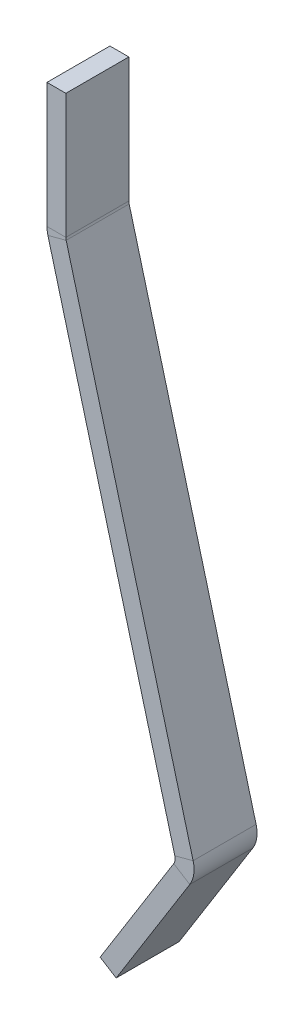
ISO-10303-21;
HEADER;
FILE_DESCRIPTION(('STEP AP214'),'2;1');
FILE_NAME('part.step','',(''),(''),'','','');
FILE_SCHEMA(('AUTOMOTIVE_DESIGN { 1 0 10303 214 1 1 1 1 }'));
ENDSEC;
DATA;
#1=APPLICATION_CONTEXT('core data for automotive mechanical design processes');
#2=APPLICATION_PROTOCOL_DEFINITION('international standard','automotive_design',2000,#1);
#3=PRODUCT_CONTEXT('',#1,'mechanical');
#4=PRODUCT('Part','Part','',(#3));
#5=PRODUCT_RELATED_PRODUCT_CATEGORY('part','',(#4));
#6=PRODUCT_DEFINITION_FORMATION('','',#4);
#7=PRODUCT_DEFINITION_CONTEXT('part definition',#1,'design');
#8=PRODUCT_DEFINITION('design','',#6,#7);
#9=PRODUCT_DEFINITION_SHAPE('','',#8);
#10=(LENGTH_UNIT() NAMED_UNIT(*) SI_UNIT(.MILLI.,.METRE.));
#11=(NAMED_UNIT(*) PLANE_ANGLE_UNIT() SI_UNIT($,.RADIAN.));
#12=(NAMED_UNIT(*) SI_UNIT($,.STERADIAN.) SOLID_ANGLE_UNIT());
#13=UNCERTAINTY_MEASURE_WITH_UNIT(LENGTH_MEASURE(1.E-05),#10,'distance_accuracy_value','');
#14=(GEOMETRIC_REPRESENTATION_CONTEXT(3) GLOBAL_UNCERTAINTY_ASSIGNED_CONTEXT((#13)) GLOBAL_UNIT_ASSIGNED_CONTEXT((#10,
#11,#12)) REPRESENTATION_CONTEXT('',''));
#15=CARTESIAN_POINT('',(0.,0.,0.));
#16=DIRECTION('',(0.,0.,1.));
#17=DIRECTION('',(1.,0.,0.));
#18=AXIS2_PLACEMENT_3D('',#15,#16,#17);
#19=CARTESIAN_POINT('',(0.0250990363554734,29.5103405549286,2.5));
#20=DIRECTION('',(0.,0.,1.));
#21=DIRECTION('',(1.,0.,0.));
#22=AXIS2_PLACEMENT_3D('',#19,#20,#21);
#23=PLANE('',#22);
#24=DIRECTION('',(-0.965925826289068,-0.258819045102522,0.));
#25=VECTOR('',#24,1.);
#26=CARTESIAN_POINT('',(0.0250990363554734,29.5103405549286,2.5));
#27=LINE('',#26,#25);
#28=CARTESIAN_POINT('',(0.0250990363554734,29.5103405549286,2.5));
#29=VERTEX_POINT('',#28);
#30=CARTESIAN_POINT('',(-1.42378970307813,29.1221119872748,2.5));
#31=VERTEX_POINT('',#30);
#32=EDGE_CURVE('E11',#29,#31,#27,.T.);
#33=ORIENTED_EDGE('',*,*,#32,.F.);
#34=CARTESIAN_POINT('',(0.736600000000001,29.7009866635511,2.5));
#35=DIRECTION('',(0.,0.,-1.));
#36=DIRECTION('',(-1.,0.,0.));
#37=AXIS2_PLACEMENT_3D('',#34,#35,#36);
#38=CIRCLE('',#37,0.7366);
#39=CARTESIAN_POINT('',(0.,29.7009866635511,2.5));
#40=VERTEX_POINT('',#39);
#41=EDGE_CURVE('E193',#40,#29,#38,.F.);
#42=ORIENTED_EDGE('',*,*,#41,.F.);
#43=DIRECTION('',(1.,0.,0.));
#44=VECTOR('',#43,1.);
#45=CARTESIAN_POINT('',(-1.5,29.7009866635511,2.5));
#46=LINE('',#45,#44);
#47=CARTESIAN_POINT('',(-1.5,29.7009866635511,2.5));
#48=VERTEX_POINT('',#47);
#49=EDGE_CURVE('E46',#48,#40,#46,.T.);
#50=ORIENTED_EDGE('',*,*,#49,.F.);
#51=CARTESIAN_POINT('',(0.736600000000001,29.7009866635511,2.5));
#52=DIRECTION('',(0.,0.,1.));
#53=DIRECTION('',(1.,0.,0.));
#54=AXIS2_PLACEMENT_3D('',#51,#52,#53);
#55=CIRCLE('',#54,2.2366);
#56=EDGE_CURVE('E205',#48,#31,#55,.T.);
#57=ORIENTED_EDGE('',*,*,#56,.T.);
#58=EDGE_LOOP('',(#33,#42,#50,#57));
#59=FACE_BOUND('',#58,.T.);
#60=ADVANCED_FACE('F39',(#59),#23,.T.);
#61=CARTESIAN_POINT('',(-1.5,29.7009866635511,2.5));
#62=DIRECTION('',(0.,0.,1.));
#63=DIRECTION('',(1.,0.,0.));
#64=AXIS2_PLACEMENT_3D('',#61,#62,#63);
#65=PLANE('',#64);
#66=DIRECTION('',(0.258819045102522,-0.965925826289068,0.));
#67=VECTOR('',#66,1.);
#68=CARTESIAN_POINT('',(0.,29.6040114338282,2.5));
#69=LINE('',#68,#67);
#70=CARTESIAN_POINT('',(10.1010599313044,-8.09365744009794,2.5));
#71=VERTEX_POINT('',#70);
#72=EDGE_CURVE('E190',#29,#71,#69,.T.);
#73=ORIENTED_EDGE('',*,*,#72,.F.);
#74=ORIENTED_EDGE('',*,*,#32,.T.);
#75=DIRECTION('',(0.258819045102522,-0.965925826289068,0.));
#76=VECTOR('',#75,1.);
#77=CARTESIAN_POINT('',(-1.4488887394336,29.2157828661745,2.5));
#78=LINE('',#77,#76);
#79=CARTESIAN_POINT('',(8.65217119187082,-8.48188600775172,2.5));
#80=VERTEX_POINT('',#79);
#81=EDGE_CURVE('E208',#31,#80,#78,.T.);
#82=ORIENTED_EDGE('',*,*,#81,.T.);
#83=DIRECTION('',(0.965925826289068,0.258819045102522,0.));
#84=VECTOR('',#83,1.);
#85=CARTESIAN_POINT('',(8.65217119187082,-8.48188600775172,2.5));
#86=LINE('',#85,#84);
#87=EDGE_CURVE('E60',#80,#71,#86,.T.);
#88=ORIENTED_EDGE('',*,*,#87,.T.);
#89=EDGE_LOOP('',(#73,#74,#82,#88));
#90=FACE_BOUND('',#89,.T.);
#91=ADVANCED_FACE('F284',(#90),#65,.T.);
#92=CARTESIAN_POINT('',(0.,29.7009866635511,-2.5));
#93=DIRECTION('',(0.,0.,-1.));
#94=DIRECTION('',(-1.,0.,0.));
#95=AXIS2_PLACEMENT_3D('',#92,#93,#94);
#96=PLANE('',#95);
#97=DIRECTION('',(-1.,0.,0.));
#98=VECTOR('',#97,1.);
#99=CARTESIAN_POINT('',(0.,29.7009866635511,-2.5));
#100=LINE('',#99,#98);
#101=CARTESIAN_POINT('',(0.,29.7009866635511,-2.5));
#102=VERTEX_POINT('',#101);
#103=CARTESIAN_POINT('',(-1.5,29.7009866635511,-2.5));
#104=VERTEX_POINT('',#103);
#105=EDGE_CURVE('E246',#102,#104,#100,.T.);
#106=ORIENTED_EDGE('',*,*,#105,.F.);
#107=CARTESIAN_POINT('',(0.736600000000001,29.7009866635511,-2.5));
#108=DIRECTION('',(0.,0.,-1.));
#109=DIRECTION('',(-1.,0.,0.));
#110=AXIS2_PLACEMENT_3D('',#107,#108,#109);
#111=CIRCLE('',#110,0.7366);
#112=CARTESIAN_POINT('',(0.0250990363554734,29.5103405549286,-2.5));
#113=VERTEX_POINT('',#112);
#114=EDGE_CURVE('E161',#102,#113,#111,.F.);
#115=ORIENTED_EDGE('',*,*,#114,.T.);
#116=DIRECTION('',(0.965925826289068,0.258819045102522,0.));
#117=VECTOR('',#116,1.);
#118=CARTESIAN_POINT('',(-1.42378970307813,29.1221119872748,-2.5));
#119=LINE('',#118,#117);
#120=CARTESIAN_POINT('',(-1.42378970307813,29.1221119872748,-2.5));
#121=VERTEX_POINT('',#120);
#122=EDGE_CURVE('E244',#121,#113,#119,.T.);
#123=ORIENTED_EDGE('',*,*,#122,.F.);
#124=CARTESIAN_POINT('',(0.736600000000001,29.7009866635511,-2.5));
#125=DIRECTION('',(0.,0.,1.));
#126=DIRECTION('',(1.,0.,0.));
#127=AXIS2_PLACEMENT_3D('',#124,#125,#126);
#128=CIRCLE('',#127,2.2366);
#129=EDGE_CURVE('E173',#104,#121,#128,.T.);
#130=ORIENTED_EDGE('',*,*,#129,.F.);
#131=EDGE_LOOP('',(#106,#115,#123,#130));
#132=FACE_BOUND('',#131,.T.);
#133=ADVANCED_FACE('F290',(#132),#96,.T.);
#134=CARTESIAN_POINT('',(-1.42378970307813,29.1221119872748,-2.5));
#135=DIRECTION('',(0.,0.,-1.));
#136=DIRECTION('',(-1.,0.,0.));
#137=AXIS2_PLACEMENT_3D('',#134,#135,#136);
#138=PLANE('',#137);
#139=DIRECTION('',(0.,-1.,0.));
#140=VECTOR('',#139,1.);
#141=CARTESIAN_POINT('',(0.,39.6040114338282,-2.5));
#142=LINE('',#141,#140);
#143=CARTESIAN_POINT('',(0.,39.6040114338282,-2.5));
#144=VERTEX_POINT('',#143);
#145=EDGE_CURVE('E164',#144,#102,#142,.T.);
#146=ORIENTED_EDGE('',*,*,#145,.T.);
#147=ORIENTED_EDGE('',*,*,#105,.T.);
#148=DIRECTION('',(0.,-1.,0.));
#149=VECTOR('',#148,1.);
#150=CARTESIAN_POINT('',(-1.5,39.6040114338282,-2.5));
#151=LINE('',#150,#149);
#152=CARTESIAN_POINT('',(-1.5,39.6040114338282,-2.5));
#153=VERTEX_POINT('',#152);
#154=EDGE_CURVE('E170',#153,#104,#151,.T.);
#155=ORIENTED_EDGE('',*,*,#154,.F.);
#156=DIRECTION('',(1.,0.,0.));
#157=VECTOR('',#156,1.);
#158=CARTESIAN_POINT('',(-1.5,39.6040114338282,-2.5));
#159=LINE('',#158,#157);
#160=EDGE_CURVE('E167',#153,#144,#159,.T.);
#161=ORIENTED_EDGE('',*,*,#160,.T.);
#162=EDGE_LOOP('',(#146,#147,#155,#161));
#163=FACE_BOUND('',#162,.T.);
#164=ADVANCED_FACE('F268',(#163),#138,.T.);
#165=CARTESIAN_POINT('',(9.83741460008976,-9.85774954275822,2.5));
#166=DIRECTION('',(0.,0.,1.));
#167=DIRECTION('',(1.,0.,0.));
#168=AXIS2_PLACEMENT_3D('',#165,#166,#167);
#169=PLANE('',#168);
#170=DIRECTION('',(-0.848048096156425,0.529919264233206,0.));
#171=VECTOR('',#170,1.);
#172=CARTESIAN_POINT('',(9.83741460008976,-9.85774954275822,2.5));
#173=LINE('',#172,#171);
#174=CARTESIAN_POINT('',(9.83741460008976,-9.85774954275822,2.5));
#175=VERTEX_POINT('',#174);
#176=CARTESIAN_POINT('',(8.56534245585512,-9.06287064640841,2.5));
#177=VERTEX_POINT('',#176);
#178=EDGE_CURVE('E53',#175,#177,#173,.T.);
#179=ORIENTED_EDGE('',*,*,#178,.F.);
#180=CARTESIAN_POINT('',(7.9406702282263,-8.67253211637424,2.5));
#181=DIRECTION('',(0.,0.,1.));
#182=DIRECTION('',(1.,0.,0.));
#183=AXIS2_PLACEMENT_3D('',#180,#181,#182);
#184=CIRCLE('',#183,2.2366);
#185=EDGE_CURVE('E187',#71,#175,#184,.F.);
#186=ORIENTED_EDGE('',*,*,#185,.F.);
#187=ORIENTED_EDGE('',*,*,#87,.F.);
#188=CARTESIAN_POINT('',(7.9406702282263,-8.67253211637424,2.5));
#189=DIRECTION('',(0.,0.,1.));
#190=DIRECTION('',(1.,0.,0.));
#191=AXIS2_PLACEMENT_3D('',#188,#189,#190);
#192=CIRCLE('',#191,0.7366);
#193=EDGE_CURVE('E210',#80,#177,#192,.F.);
#194=ORIENTED_EDGE('',*,*,#193,.T.);
#195=EDGE_LOOP('',(#179,#186,#187,#194));
#196=FACE_BOUND('',#195,.T.);
#197=ADVANCED_FACE('F299',(#196),#169,.T.);
#198=CARTESIAN_POINT('',(8.65217119187082,-8.48188600775172,2.5));
#199=DIRECTION('',(0.,0.,1.));
#200=DIRECTION('',(1.,0.,0.));
#201=AXIS2_PLACEMENT_3D('',#198,#199,#200);
#202=PLANE('',#201);
#203=DIRECTION('',(-0.529919264233206,-0.848048096156426,0.));
#204=VECTOR('',#203,1.);
#205=CARTESIAN_POINT('',(10.3527618041009,-9.03302161773449,2.5));
#206=LINE('',#205,#204);
#207=CARTESIAN_POINT('',(3.9937306333024,-19.2095987716116,2.5));
#208=VERTEX_POINT('',#207);
#209=EDGE_CURVE('E184',#175,#208,#206,.T.);
#210=ORIENTED_EDGE('',*,*,#209,.F.);
#211=ORIENTED_EDGE('',*,*,#178,.T.);
#212=DIRECTION('',(-0.529919264233206,-0.848048096156426,0.));
#213=VECTOR('',#212,1.);
#214=CARTESIAN_POINT('',(9.08068965986623,-8.23814272138468,2.5));
#215=LINE('',#214,#213);
#216=CARTESIAN_POINT('',(2.72165848906776,-18.4147198752618,2.5));
#217=VERTEX_POINT('',#216);
#218=EDGE_CURVE('E181',#177,#217,#215,.T.);
#219=ORIENTED_EDGE('',*,*,#218,.T.);
#220=DIRECTION('',(-0.848048096156427,0.529919264233203,0.));
#221=VECTOR('',#220,1.);
#222=CARTESIAN_POINT('',(3.9937306333024,-19.2095987716116,2.5));
#223=LINE('',#222,#221);
#224=EDGE_CURVE('E132',#208,#217,#223,.T.);
#225=ORIENTED_EDGE('',*,*,#224,.F.);
#226=EDGE_LOOP('',(#210,#211,#219,#225));
#227=FACE_BOUND('',#226,.T.);
#228=ADVANCED_FACE('F304',(#227),#202,.T.);
#229=CARTESIAN_POINT('',(10.1010599313044,-8.09365744009794,-2.5));
#230=DIRECTION('',(0.,0.,-1.));
#231=DIRECTION('',(-1.,0.,0.));
#232=AXIS2_PLACEMENT_3D('',#229,#230,#231);
#233=PLANE('',#232);
#234=DIRECTION('',(-0.965925826289068,-0.258819045102522,0.));
#235=VECTOR('',#234,1.);
#236=CARTESIAN_POINT('',(10.1010599313044,-8.09365744009794,-2.5));
#237=LINE('',#236,#235);
#238=CARTESIAN_POINT('',(10.1010599313044,-8.09365744009794,-2.5));
#239=VERTEX_POINT('',#238);
#240=CARTESIAN_POINT('',(8.65217119187082,-8.48188600775172,-2.5));
#241=VERTEX_POINT('',#240);
#242=EDGE_CURVE('E240',#239,#241,#237,.T.);
#243=ORIENTED_EDGE('',*,*,#242,.F.);
#244=CARTESIAN_POINT('',(7.9406702282263,-8.67253211637424,-2.5));
#245=DIRECTION('',(0.,0.,1.));
#246=DIRECTION('',(1.,0.,0.));
#247=AXIS2_PLACEMENT_3D('',#244,#245,#246);
#248=CIRCLE('',#247,2.2366);
#249=CARTESIAN_POINT('',(9.83741460008976,-9.85774954275822,-2.5));
#250=VERTEX_POINT('',#249);
#251=EDGE_CURVE('E155',#239,#250,#248,.F.);
#252=ORIENTED_EDGE('',*,*,#251,.T.);
#253=DIRECTION('',(0.848048096156425,-0.529919264233206,0.));
#254=VECTOR('',#253,1.);
#255=CARTESIAN_POINT('',(8.56534245585512,-9.06287064640841,-2.5));
#256=LINE('',#255,#254);
#257=CARTESIAN_POINT('',(8.56534245585512,-9.06287064640841,-2.5));
#258=VERTEX_POINT('',#257);
#259=EDGE_CURVE('E136',#258,#250,#256,.T.);
#260=ORIENTED_EDGE('',*,*,#259,.F.);
#261=CARTESIAN_POINT('',(7.9406702282263,-8.67253211637424,-2.5));
#262=DIRECTION('',(0.,0.,1.));
#263=DIRECTION('',(1.,0.,0.));
#264=AXIS2_PLACEMENT_3D('',#261,#262,#263);
#265=CIRCLE('',#264,0.7366);
#266=EDGE_CURVE('E179',#241,#258,#265,.F.);
#267=ORIENTED_EDGE('',*,*,#266,.F.);
#268=EDGE_LOOP('',(#243,#252,#260,#267));
#269=FACE_BOUND('',#268,.T.);
#270=ADVANCED_FACE('F296',(#269),#233,.T.);
#271=CARTESIAN_POINT('',(8.56534245585512,-9.06287064640841,-2.5));
#272=DIRECTION('',(0.,0.,-1.));
#273=DIRECTION('',(-1.,0.,0.));
#274=AXIS2_PLACEMENT_3D('',#271,#272,#273);
#275=PLANE('',#274);
#276=DIRECTION('',(0.258819045102522,-0.965925826289068,0.));
#277=VECTOR('',#276,1.);
#278=CARTESIAN_POINT('',(0.,29.6040114338282,-2.5));
#279=LINE('',#278,#277);
#280=EDGE_CURVE('E158',#113,#239,#279,.T.);
#281=ORIENTED_EDGE('',*,*,#280,.T.);
#282=ORIENTED_EDGE('',*,*,#242,.T.);
#283=DIRECTION('',(0.258819045102522,-0.965925826289068,0.));
#284=VECTOR('',#283,1.);
#285=CARTESIAN_POINT('',(-1.4488887394336,29.2157828661745,-2.5));
#286=LINE('',#285,#284);
#287=EDGE_CURVE('E176',#121,#241,#286,.T.);
#288=ORIENTED_EDGE('',*,*,#287,.F.);
#289=ORIENTED_EDGE('',*,*,#122,.T.);
#290=EDGE_LOOP('',(#281,#282,#288,#289));
#291=FACE_BOUND('',#290,.T.);
#292=ADVANCED_FACE('F292',(#291),#275,.T.);
#293=CARTESIAN_POINT('',(9.08068965986623,-8.23814272138468,2.5));
#294=DIRECTION('',(0.848048096156426,-0.529919264233206,0.));
#295=DIRECTION('',(0.529919264233206,0.848048096156426,0.));
#296=AXIS2_PLACEMENT_3D('',#293,#294,#295);
#297=PLANE('',#296);
#298=DIRECTION('',(0.,0.,-1.));
#299=VECTOR('',#298,1.);
#300=CARTESIAN_POINT('',(8.56534245585512,-9.06287064640841,2.5));
#301=LINE('',#300,#299);
#302=EDGE_CURVE('E151',#177,#258,#301,.T.);
#303=ORIENTED_EDGE('',*,*,#302,.T.);
#304=DIRECTION('',(-0.529919264233206,-0.848048096156426,0.));
#305=VECTOR('',#304,1.);
#306=CARTESIAN_POINT('',(9.08068965986623,-8.23814272138468,-2.5));
#307=LINE('',#306,#305);
#308=CARTESIAN_POINT('',(2.72165848906776,-18.4147198752618,-2.5));
#309=VERTEX_POINT('',#308);
#310=EDGE_CURVE('E143',#258,#309,#307,.T.);
#311=ORIENTED_EDGE('',*,*,#310,.T.);
#312=DIRECTION('',(0.,0.,-1.));
#313=VECTOR('',#312,1.);
#314=CARTESIAN_POINT('',(2.72165848906776,-18.4147198752618,2.5));
#315=LINE('',#314,#313);
#316=EDGE_CURVE('E127',#217,#309,#315,.T.);
#317=ORIENTED_EDGE('',*,*,#316,.F.);
#318=ORIENTED_EDGE('',*,*,#218,.F.);
#319=EDGE_LOOP('',(#303,#311,#317,#318));
#320=FACE_BOUND('',#319,.T.);
#321=ADVANCED_FACE('F149',(#320),#297,.F.);
#322=CARTESIAN_POINT('',(3.9937306333024,-19.2095987716116,2.5));
#323=DIRECTION('',(-0.529919264233203,-0.848048096156427,0.));
#324=DIRECTION('',(0.848048096156427,-0.529919264233203,0.));
#325=AXIS2_PLACEMENT_3D('',#322,#323,#324);
#326=PLANE('',#325);
#327=ORIENTED_EDGE('',*,*,#316,.T.);
#328=DIRECTION('',(-0.848048096156427,0.529919264233203,0.));
#329=VECTOR('',#328,1.);
#330=CARTESIAN_POINT('',(3.9937306333024,-19.2095987716116,-2.5));
#331=LINE('',#330,#329);
#332=CARTESIAN_POINT('',(3.9937306333024,-19.2095987716116,-2.5));
#333=VERTEX_POINT('',#332);
#334=EDGE_CURVE('E130',#333,#309,#331,.T.);
#335=ORIENTED_EDGE('',*,*,#334,.F.);
#336=DIRECTION('',(0.,0.,-1.));
#337=VECTOR('',#336,1.);
#338=CARTESIAN_POINT('',(3.9937306333024,-19.2095987716116,2.5));
#339=LINE('',#338,#337);
#340=EDGE_CURVE('E137',#208,#333,#339,.T.);
#341=ORIENTED_EDGE('',*,*,#340,.F.);
#342=ORIENTED_EDGE('',*,*,#224,.T.);
#343=EDGE_LOOP('',(#327,#335,#341,#342));
#344=FACE_BOUND('',#343,.T.);
#345=ADVANCED_FACE('F129',(#344),#326,.T.);
#346=CARTESIAN_POINT('',(10.3527618041009,-9.03302161773449,2.5));
#347=DIRECTION('',(0.848048096156426,-0.529919264233206,0.));
#348=DIRECTION('',(0.529919264233206,0.848048096156426,0.));
#349=AXIS2_PLACEMENT_3D('',#346,#347,#348);
#350=PLANE('',#349);
#351=ORIENTED_EDGE('',*,*,#340,.T.);
#352=DIRECTION('',(-0.529919264233206,-0.848048096156426,0.));
#353=VECTOR('',#352,1.);
#354=CARTESIAN_POINT('',(10.3527618041009,-9.03302161773449,-2.5));
#355=LINE('',#354,#353);
#356=EDGE_CURVE('E146',#250,#333,#355,.T.);
#357=ORIENTED_EDGE('',*,*,#356,.F.);
#358=DIRECTION('',(0.,0.,-1.));
#359=VECTOR('',#358,1.);
#360=CARTESIAN_POINT('',(9.83741460008976,-9.85774954275822,2.5));
#361=LINE('',#360,#359);
#362=EDGE_CURVE('E235',#175,#250,#361,.T.);
#363=ORIENTED_EDGE('',*,*,#362,.F.);
#364=ORIENTED_EDGE('',*,*,#209,.T.);
#365=EDGE_LOOP('',(#351,#357,#363,#364));
#366=FACE_BOUND('',#365,.T.);
#367=ADVANCED_FACE('F302',(#366),#350,.T.);
#368=CARTESIAN_POINT('',(7.9406702282263,-8.67253211637424,2.5));
#369=DIRECTION('',(0.,0.,-1.));
#370=DIRECTION('',(-1.,0.,0.));
#371=AXIS2_PLACEMENT_3D('',#368,#369,#370);
#372=CYLINDRICAL_SURFACE('',#371,2.2366);
#373=ORIENTED_EDGE('',*,*,#362,.T.);
#374=ORIENTED_EDGE('',*,*,#251,.F.);
#375=DIRECTION('',(0.,0.,-1.));
#376=VECTOR('',#375,1.);
#377=CARTESIAN_POINT('',(10.1010599313044,-8.09365744009794,2.5));
#378=LINE('',#377,#376);
#379=EDGE_CURVE('E232',#71,#239,#378,.T.);
#380=ORIENTED_EDGE('',*,*,#379,.F.);
#381=ORIENTED_EDGE('',*,*,#185,.T.);
#382=EDGE_LOOP('',(#373,#374,#380,#381));
#383=FACE_BOUND('',#382,.T.);
#384=ADVANCED_FACE('F305',(#383),#372,.T.);
#385=CARTESIAN_POINT('',(0.,29.6040114338282,2.5));
#386=DIRECTION('',(0.965925826289068,0.258819045102522,0.));
#387=DIRECTION('',(-0.258819045102522,0.965925826289068,0.));
#388=AXIS2_PLACEMENT_3D('',#385,#386,#387);
#389=PLANE('',#388);
#390=ORIENTED_EDGE('',*,*,#379,.T.);
#391=ORIENTED_EDGE('',*,*,#280,.F.);
#392=DIRECTION('',(0.,0.,-1.));
#393=VECTOR('',#392,1.);
#394=CARTESIAN_POINT('',(0.0250990363554734,29.5103405549286,2.5));
#395=LINE('',#394,#393);
#396=EDGE_CURVE('E229',#29,#113,#395,.T.);
#397=ORIENTED_EDGE('',*,*,#396,.F.);
#398=ORIENTED_EDGE('',*,*,#72,.T.);
#399=EDGE_LOOP('',(#390,#391,#397,#398));
#400=FACE_BOUND('',#399,.T.);
#401=ADVANCED_FACE('F287',(#400),#389,.T.);
#402=CARTESIAN_POINT('',(0.736600000000001,29.7009866635511,2.5));
#403=DIRECTION('',(0.,0.,-1.));
#404=DIRECTION('',(-1.,0.,0.));
#405=AXIS2_PLACEMENT_3D('',#402,#403,#404);
#406=CYLINDRICAL_SURFACE('',#405,0.7366);
#407=ORIENTED_EDGE('',*,*,#396,.T.);
#408=ORIENTED_EDGE('',*,*,#114,.F.);
#409=DIRECTION('',(0.,0.,-1.));
#410=VECTOR('',#409,1.);
#411=CARTESIAN_POINT('',(0.,29.7009866635511,2.5));
#412=LINE('',#411,#410);
#413=EDGE_CURVE('E226',#40,#102,#412,.T.);
#414=ORIENTED_EDGE('',*,*,#413,.F.);
#415=ORIENTED_EDGE('',*,*,#41,.T.);
#416=EDGE_LOOP('',(#407,#408,#414,#415));
#417=FACE_BOUND('',#416,.T.);
#418=ADVANCED_FACE('F258',(#417),#406,.F.);
#419=CARTESIAN_POINT('',(0.,39.6040114338282,2.5));
#420=DIRECTION('',(1.,0.,0.));
#421=DIRECTION('',(0.,1.,0.));
#422=AXIS2_PLACEMENT_3D('',#419,#420,#421);
#423=PLANE('',#422);
#424=ORIENTED_EDGE('',*,*,#413,.T.);
#425=ORIENTED_EDGE('',*,*,#145,.F.);
#426=DIRECTION('',(0.,0.,-1.));
#427=VECTOR('',#426,1.);
#428=CARTESIAN_POINT('',(0.,39.6040114338282,2.5));
#429=LINE('',#428,#427);
#430=CARTESIAN_POINT('',(0.,39.6040114338282,2.5));
#431=VERTEX_POINT('',#430);
#432=EDGE_CURVE('E224',#431,#144,#429,.T.);
#433=ORIENTED_EDGE('',*,*,#432,.F.);
#434=DIRECTION('',(0.,-1.,0.));
#435=VECTOR('',#434,1.);
#436=CARTESIAN_POINT('',(0.,39.6040114338282,2.5));
#437=LINE('',#436,#435);
#438=EDGE_CURVE('E196',#431,#40,#437,.T.);
#439=ORIENTED_EDGE('',*,*,#438,.T.);
#440=EDGE_LOOP('',(#424,#425,#433,#439));
#441=FACE_BOUND('',#440,.T.);
#442=ADVANCED_FACE('F262',(#441),#423,.T.);
#443=CARTESIAN_POINT('',(-1.5,39.6040114338282,2.5));
#444=DIRECTION('',(0.,1.,0.));
#445=DIRECTION('',(0.,0.,1.));
#446=AXIS2_PLACEMENT_3D('',#443,#444,#445);
#447=PLANE('',#446);
#448=ORIENTED_EDGE('',*,*,#432,.T.);
#449=ORIENTED_EDGE('',*,*,#160,.F.);
#450=DIRECTION('',(0.,0.,-1.));
#451=VECTOR('',#450,1.);
#452=CARTESIAN_POINT('',(-1.5,39.6040114338282,2.5));
#453=LINE('',#452,#451);
#454=CARTESIAN_POINT('',(-1.5,39.6040114338282,2.5));
#455=VERTEX_POINT('',#454);
#456=EDGE_CURVE('E222',#455,#153,#453,.T.);
#457=ORIENTED_EDGE('',*,*,#456,.F.);
#458=DIRECTION('',(1.,0.,0.));
#459=VECTOR('',#458,1.);
#460=CARTESIAN_POINT('',(-1.5,39.6040114338282,2.5));
#461=LINE('',#460,#459);
#462=EDGE_CURVE('E199',#455,#431,#461,.T.);
#463=ORIENTED_EDGE('',*,*,#462,.T.);
#464=EDGE_LOOP('',(#448,#449,#457,#463));
#465=FACE_BOUND('',#464,.T.);
#466=ADVANCED_FACE('F265',(#465),#447,.T.);
#467=CARTESIAN_POINT('',(-1.5,39.6040114338282,2.5));
#468=DIRECTION('',(1.,0.,0.));
#469=DIRECTION('',(0.,1.,0.));
#470=AXIS2_PLACEMENT_3D('',#467,#468,#469);
#471=PLANE('',#470);
#472=ORIENTED_EDGE('',*,*,#456,.T.);
#473=ORIENTED_EDGE('',*,*,#154,.T.);
#474=DIRECTION('',(0.,0.,-1.));
#475=VECTOR('',#474,1.);
#476=CARTESIAN_POINT('',(-1.5,29.7009866635511,2.5));
#477=LINE('',#476,#475);
#478=EDGE_CURVE('E219',#48,#104,#477,.T.);
#479=ORIENTED_EDGE('',*,*,#478,.F.);
#480=DIRECTION('',(0.,-1.,0.));
#481=VECTOR('',#480,1.);
#482=CARTESIAN_POINT('',(-1.5,39.6040114338282,2.5));
#483=LINE('',#482,#481);
#484=EDGE_CURVE('E202',#455,#48,#483,.T.);
#485=ORIENTED_EDGE('',*,*,#484,.F.);
#486=EDGE_LOOP('',(#472,#473,#479,#485));
#487=FACE_BOUND('',#486,.T.);
#488=ADVANCED_FACE('F270',(#487),#471,.F.);
#489=CARTESIAN_POINT('',(0.736600000000001,29.7009866635511,2.5));
#490=DIRECTION('',(0.,0.,-1.));
#491=DIRECTION('',(-1.,0.,0.));
#492=AXIS2_PLACEMENT_3D('',#489,#490,#491);
#493=CYLINDRICAL_SURFACE('',#492,2.2366);
#494=ORIENTED_EDGE('',*,*,#478,.T.);
#495=ORIENTED_EDGE('',*,*,#129,.T.);
#496=DIRECTION('',(0.,0.,-1.));
#497=VECTOR('',#496,1.);
#498=CARTESIAN_POINT('',(-1.42378970307813,29.1221119872748,2.5));
#499=LINE('',#498,#497);
#500=EDGE_CURVE('E216',#31,#121,#499,.T.);
#501=ORIENTED_EDGE('',*,*,#500,.F.);
#502=ORIENTED_EDGE('',*,*,#56,.F.);
#503=EDGE_LOOP('',(#494,#495,#501,#502));
#504=FACE_BOUND('',#503,.T.);
#505=ADVANCED_FACE('F275',(#504),#493,.T.);
#506=CARTESIAN_POINT('',(-1.4488887394336,29.2157828661745,2.5));
#507=DIRECTION('',(0.965925826289068,0.258819045102522,0.));
#508=DIRECTION('',(-0.258819045102522,0.965925826289068,0.));
#509=AXIS2_PLACEMENT_3D('',#506,#507,#508);
#510=PLANE('',#509);
#511=ORIENTED_EDGE('',*,*,#500,.T.);
#512=ORIENTED_EDGE('',*,*,#287,.T.);
#513=DIRECTION('',(0.,0.,-1.));
#514=VECTOR('',#513,1.);
#515=CARTESIAN_POINT('',(8.65217119187082,-8.48188600775172,2.5));
#516=LINE('',#515,#514);
#517=EDGE_CURVE('E213',#80,#241,#516,.T.);
#518=ORIENTED_EDGE('',*,*,#517,.F.);
#519=ORIENTED_EDGE('',*,*,#81,.F.);
#520=EDGE_LOOP('',(#511,#512,#518,#519));
#521=FACE_BOUND('',#520,.T.);
#522=ADVANCED_FACE('F280',(#521),#510,.F.);
#523=CARTESIAN_POINT('',(7.9406702282263,-8.67253211637424,2.5));
#524=DIRECTION('',(0.,0.,-1.));
#525=DIRECTION('',(-1.,0.,0.));
#526=AXIS2_PLACEMENT_3D('',#523,#524,#525);
#527=CYLINDRICAL_SURFACE('',#526,0.7366);
#528=ORIENTED_EDGE('',*,*,#517,.T.);
#529=ORIENTED_EDGE('',*,*,#266,.T.);
#530=ORIENTED_EDGE('',*,*,#302,.F.);
#531=ORIENTED_EDGE('',*,*,#193,.F.);
#532=EDGE_LOOP('',(#528,#529,#530,#531));
#533=FACE_BOUND('',#532,.T.);
#534=ADVANCED_FACE('F298',(#533),#527,.F.);
#535=CARTESIAN_POINT('',(7.9406702282263,-8.67253211637424,2.5));
#536=DIRECTION('',(0.,0.,1.));
#537=DIRECTION('',(1.,0.,0.));
#538=AXIS2_PLACEMENT_3D('',#535,#536,#537);
#539=PLANE('',#538);
#540=ORIENTED_EDGE('',*,*,#484,.T.);
#541=ORIENTED_EDGE('',*,*,#49,.T.);
#542=ORIENTED_EDGE('',*,*,#438,.F.);
#543=ORIENTED_EDGE('',*,*,#462,.F.);
#544=EDGE_LOOP('',(#540,#541,#542,#543));
#545=FACE_BOUND('',#544,.T.);
#546=ADVANCED_FACE('F250',(#545),#539,.T.);
#547=CARTESIAN_POINT('',(7.9406702282263,-8.67253211637424,-2.5));
#548=DIRECTION('',(0.,0.,1.));
#549=DIRECTION('',(1.,0.,0.));
#550=AXIS2_PLACEMENT_3D('',#547,#548,#549);
#551=PLANE('',#550);
#552=ORIENTED_EDGE('',*,*,#310,.F.);
#553=ORIENTED_EDGE('',*,*,#259,.T.);
#554=ORIENTED_EDGE('',*,*,#356,.T.);
#555=ORIENTED_EDGE('',*,*,#334,.T.);
#556=EDGE_LOOP('',(#552,#553,#554,#555));
#557=FACE_BOUND('',#556,.T.);
#558=ADVANCED_FACE('F142',(#557),#551,.F.);
#559=CLOSED_SHELL('',(#60,#91,#133,#164,#197,#228,#270,#292,#321,#345,#367,#384,#401,#418,#442,
#466,#488,#505,#522,#534,#546,#558));
#560=MANIFOLD_SOLID_BREP('B2',#559);
#561=ADVANCED_BREP_SHAPE_REPRESENTATION('',(#18,#560),#14);
#562=SHAPE_DEFINITION_REPRESENTATION(#9,#561);
ENDSEC;
END-ISO-10303-21;
